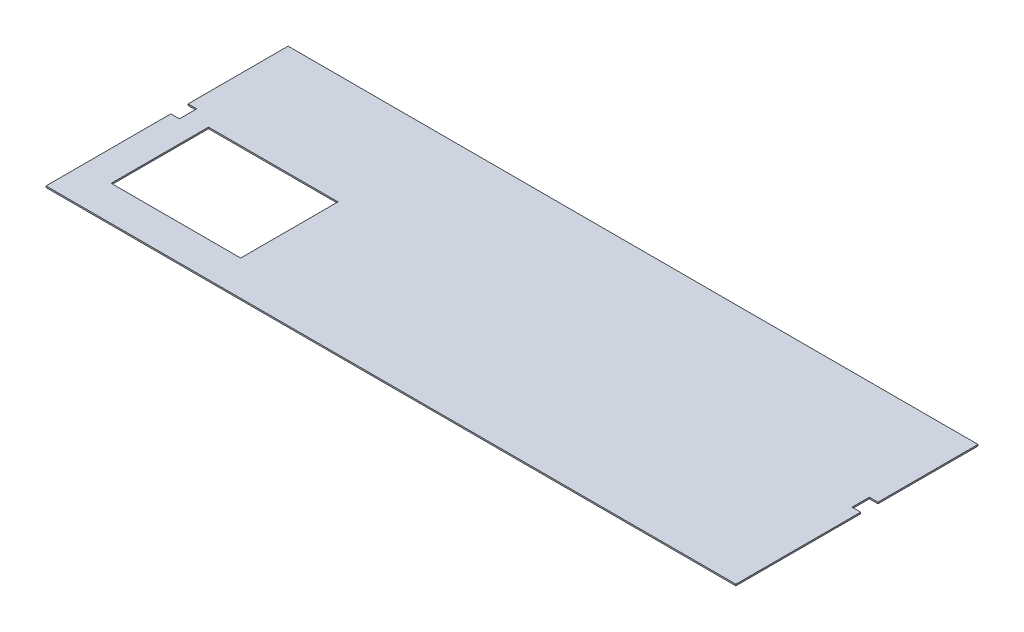
ISO-10303-21;
HEADER;
FILE_DESCRIPTION(('STEP AP214'),'2;1');
FILE_NAME('part.step','',(''),(''),'','','');
FILE_SCHEMA(('AUTOMOTIVE_DESIGN { 1 0 10303 214 1 1 1 1 }'));
ENDSEC;
DATA;
#1=APPLICATION_CONTEXT('core data for automotive mechanical design processes');
#2=APPLICATION_PROTOCOL_DEFINITION('international standard','automotive_design',2000,#1);
#3=PRODUCT_CONTEXT('',#1,'mechanical');
#4=PRODUCT('Part','Part','',(#3));
#5=PRODUCT_RELATED_PRODUCT_CATEGORY('part','',(#4));
#6=PRODUCT_DEFINITION_FORMATION('','',#4);
#7=PRODUCT_DEFINITION_CONTEXT('part definition',#1,'design');
#8=PRODUCT_DEFINITION('design','',#6,#7);
#9=PRODUCT_DEFINITION_SHAPE('','',#8);
#10=(LENGTH_UNIT() NAMED_UNIT(*) SI_UNIT(.MILLI.,.METRE.));
#11=(NAMED_UNIT(*) PLANE_ANGLE_UNIT() SI_UNIT($,.RADIAN.));
#12=(NAMED_UNIT(*) SI_UNIT($,.STERADIAN.) SOLID_ANGLE_UNIT());
#13=UNCERTAINTY_MEASURE_WITH_UNIT(LENGTH_MEASURE(1.E-05),#10,'distance_accuracy_value','');
#14=(GEOMETRIC_REPRESENTATION_CONTEXT(3) GLOBAL_UNCERTAINTY_ASSIGNED_CONTEXT((#13)) GLOBAL_UNIT_ASSIGNED_CONTEXT((#10,
#11,#12)) REPRESENTATION_CONTEXT('',''));
#15=CARTESIAN_POINT('',(0.,0.,0.));
#16=DIRECTION('',(0.,0.,1.));
#17=DIRECTION('',(1.,0.,0.));
#18=AXIS2_PLACEMENT_3D('',#15,#16,#17);
#19=CARTESIAN_POINT('',(762.,3.175,-46.42));
#20=DIRECTION('',(-1.,0.,0.));
#21=DIRECTION('',(0.,0.,1.));
#22=AXIS2_PLACEMENT_3D('',#19,#20,#21);
#23=PLANE('',#22);
#24=DIRECTION('',(0.,0.,-1.));
#25=VECTOR('',#24,1.);
#26=CARTESIAN_POINT('',(762.,0.,-46.42));
#27=LINE('',#26,#25);
#28=CARTESIAN_POINT('',(762.,0.,-46.42));
#29=VERTEX_POINT('',#28);
#30=CARTESIAN_POINT('',(762.,0.,-267.42));
#31=VERTEX_POINT('',#30);
#32=EDGE_CURVE('E163',#29,#31,#27,.T.);
#33=ORIENTED_EDGE('',*,*,#32,.T.);
#34=DIRECTION('',(0.,-1.,0.));
#35=VECTOR('',#34,1.);
#36=CARTESIAN_POINT('',(762.,3.175,-267.42));
#37=LINE('',#36,#35);
#38=CARTESIAN_POINT('',(762.,3.175,-267.42));
#39=VERTEX_POINT('',#38);
#40=EDGE_CURVE('E11',#39,#31,#37,.T.);
#41=ORIENTED_EDGE('',*,*,#40,.F.);
#42=DIRECTION('',(0.,0.,-1.));
#43=VECTOR('',#42,1.);
#44=CARTESIAN_POINT('',(762.,3.175,-46.42));
#45=LINE('',#44,#43);
#46=CARTESIAN_POINT('',(762.,3.175,-46.42));
#47=VERTEX_POINT('',#46);
#48=EDGE_CURVE('E192',#47,#39,#45,.T.);
#49=ORIENTED_EDGE('',*,*,#48,.F.);
#50=DIRECTION('',(0.,-1.,0.));
#51=VECTOR('',#50,1.);
#52=CARTESIAN_POINT('',(762.,3.175,-46.42));
#53=LINE('',#52,#51);
#54=EDGE_CURVE('E218',#47,#29,#53,.T.);
#55=ORIENTED_EDGE('',*,*,#54,.T.);
#56=EDGE_LOOP('',(#33,#41,#49,#55));
#57=FACE_BOUND('',#56,.T.);
#58=ADVANCED_FACE('F45',(#57),#23,.F.);
#59=CARTESIAN_POINT('',(-762.,3.175,-267.42));
#60=DIRECTION('',(0.,0.,1.));
#61=DIRECTION('',(1.,0.,0.));
#62=AXIS2_PLACEMENT_3D('',#59,#60,#61);
#63=PLANE('',#62);
#64=DIRECTION('',(-1.,0.,0.));
#65=VECTOR('',#64,1.);
#66=CARTESIAN_POINT('',(-762.,0.,-267.42));
#67=LINE('',#66,#65);
#68=CARTESIAN_POINT('',(-762.,0.,-267.42));
#69=VERTEX_POINT('',#68);
#70=EDGE_CURVE('E221',#31,#69,#67,.T.);
#71=ORIENTED_EDGE('',*,*,#70,.T.);
#72=DIRECTION('',(0.,-1.,0.));
#73=VECTOR('',#72,1.);
#74=CARTESIAN_POINT('',(-762.,3.175,-267.42));
#75=LINE('',#74,#73);
#76=CARTESIAN_POINT('',(-762.,3.175,-267.42));
#77=VERTEX_POINT('',#76);
#78=EDGE_CURVE('E52',#77,#69,#75,.T.);
#79=ORIENTED_EDGE('',*,*,#78,.F.);
#80=DIRECTION('',(-1.,0.,0.));
#81=VECTOR('',#80,1.);
#82=CARTESIAN_POINT('',(-762.,3.175,-267.42));
#83=LINE('',#82,#81);
#84=EDGE_CURVE('E195',#39,#77,#83,.T.);
#85=ORIENTED_EDGE('',*,*,#84,.F.);
#86=ORIENTED_EDGE('',*,*,#40,.T.);
#87=EDGE_LOOP('',(#71,#79,#85,#86));
#88=FACE_BOUND('',#87,.T.);
#89=ADVANCED_FACE('F296',(#88),#63,.F.);
#90=CARTESIAN_POINT('',(-762.,3.175,-46.42));
#91=DIRECTION('',(1.,0.,0.));
#92=DIRECTION('',(0.,0.,-1.));
#93=AXIS2_PLACEMENT_3D('',#90,#91,#92);
#94=PLANE('',#93);
#95=DIRECTION('',(0.,0.,1.));
#96=VECTOR('',#95,1.);
#97=CARTESIAN_POINT('',(-762.,0.,-46.42));
#98=LINE('',#97,#96);
#99=CARTESIAN_POINT('',(-762.,0.,-46.42));
#100=VERTEX_POINT('',#99);
#101=EDGE_CURVE('E223',#69,#100,#98,.T.);
#102=ORIENTED_EDGE('',*,*,#101,.T.);
#103=DIRECTION('',(0.,-1.,0.));
#104=VECTOR('',#103,1.);
#105=CARTESIAN_POINT('',(-762.,3.175,-46.42));
#106=LINE('',#105,#104);
#107=CARTESIAN_POINT('',(-762.,3.175,-46.42));
#108=VERTEX_POINT('',#107);
#109=EDGE_CURVE('E268',#108,#100,#106,.T.);
#110=ORIENTED_EDGE('',*,*,#109,.F.);
#111=DIRECTION('',(0.,0.,1.));
#112=VECTOR('',#111,1.);
#113=CARTESIAN_POINT('',(-762.,3.175,-46.42));
#114=LINE('',#113,#112);
#115=EDGE_CURVE('E198',#77,#108,#114,.T.);
#116=ORIENTED_EDGE('',*,*,#115,.F.);
#117=ORIENTED_EDGE('',*,*,#78,.T.);
#118=EDGE_LOOP('',(#102,#110,#116,#117));
#119=FACE_BOUND('',#118,.T.);
#120=ADVANCED_FACE('F275',(#119),#94,.F.);
#121=CARTESIAN_POINT('',(-762.,3.175,-46.42));
#122=DIRECTION('',(0.,0.,-1.));
#123=DIRECTION('',(-1.,0.,0.));
#124=AXIS2_PLACEMENT_3D('',#121,#122,#123);
#125=PLANE('',#124);
#126=DIRECTION('',(1.,0.,0.));
#127=VECTOR('',#126,1.);
#128=CARTESIAN_POINT('',(-762.,0.,-46.42));
#129=LINE('',#128,#127);
#130=CARTESIAN_POINT('',(-742.95,0.,-46.42));
#131=VERTEX_POINT('',#130);
#132=EDGE_CURVE('E225',#100,#131,#129,.T.);
#133=ORIENTED_EDGE('',*,*,#132,.T.);
#134=DIRECTION('',(0.,-1.,0.));
#135=VECTOR('',#134,1.);
#136=CARTESIAN_POINT('',(-742.95,3.175,-46.42));
#137=LINE('',#136,#135);
#138=CARTESIAN_POINT('',(-742.95,3.175,-46.42));
#139=VERTEX_POINT('',#138);
#140=EDGE_CURVE('E265',#139,#131,#137,.T.);
#141=ORIENTED_EDGE('',*,*,#140,.F.);
#142=DIRECTION('',(1.,0.,0.));
#143=VECTOR('',#142,1.);
#144=CARTESIAN_POINT('',(-762.,3.175,-46.42));
#145=LINE('',#144,#143);
#146=EDGE_CURVE('E200',#108,#139,#145,.T.);
#147=ORIENTED_EDGE('',*,*,#146,.F.);
#148=ORIENTED_EDGE('',*,*,#109,.T.);
#149=EDGE_LOOP('',(#133,#141,#147,#148));
#150=FACE_BOUND('',#149,.T.);
#151=ADVANCED_FACE('F284',(#150),#125,.F.);
#152=CARTESIAN_POINT('',(-742.95,3.175,-46.42));
#153=DIRECTION('',(1.,0.,0.));
#154=DIRECTION('',(0.,0.,-1.));
#155=AXIS2_PLACEMENT_3D('',#152,#153,#154);
#156=PLANE('',#155);
#157=DIRECTION('',(0.,0.,1.));
#158=VECTOR('',#157,1.);
#159=CARTESIAN_POINT('',(-742.95,0.,-46.42));
#160=LINE('',#159,#158);
#161=CARTESIAN_POINT('',(-742.95,0.,-8.32000000000004));
#162=VERTEX_POINT('',#161);
#163=EDGE_CURVE('E227',#131,#162,#160,.T.);
#164=ORIENTED_EDGE('',*,*,#163,.T.);
#165=DIRECTION('',(0.,-1.,0.));
#166=VECTOR('',#165,1.);
#167=CARTESIAN_POINT('',(-742.95,3.175,-8.32000000000004));
#168=LINE('',#167,#166);
#169=CARTESIAN_POINT('',(-742.95,3.175,-8.32000000000004));
#170=VERTEX_POINT('',#169);
#171=EDGE_CURVE('E262',#170,#162,#168,.T.);
#172=ORIENTED_EDGE('',*,*,#171,.F.);
#173=DIRECTION('',(0.,0.,1.));
#174=VECTOR('',#173,1.);
#175=CARTESIAN_POINT('',(-742.95,3.175,-46.42));
#176=LINE('',#175,#174);
#177=EDGE_CURVE('E202',#139,#170,#176,.T.);
#178=ORIENTED_EDGE('',*,*,#177,.F.);
#179=ORIENTED_EDGE('',*,*,#140,.T.);
#180=EDGE_LOOP('',(#164,#172,#178,#179));
#181=FACE_BOUND('',#180,.T.);
#182=ADVANCED_FACE('F288',(#181),#156,.F.);
#183=CARTESIAN_POINT('',(-742.95,3.175,-8.32000000000004));
#184=DIRECTION('',(0.,0.,1.));
#185=DIRECTION('',(1.,0.,0.));
#186=AXIS2_PLACEMENT_3D('',#183,#184,#185);
#187=PLANE('',#186);
#188=DIRECTION('',(-1.,0.,0.));
#189=VECTOR('',#188,1.);
#190=CARTESIAN_POINT('',(-742.95,0.,-8.32000000000004));
#191=LINE('',#190,#189);
#192=CARTESIAN_POINT('',(-762.,0.,-8.32000000000004));
#193=VERTEX_POINT('',#192);
#194=EDGE_CURVE('E229',#162,#193,#191,.T.);
#195=ORIENTED_EDGE('',*,*,#194,.T.);
#196=DIRECTION('',(0.,-1.,0.));
#197=VECTOR('',#196,1.);
#198=CARTESIAN_POINT('',(-762.,3.175,-8.32000000000004));
#199=LINE('',#198,#197);
#200=CARTESIAN_POINT('',(-762.,3.175,-8.32000000000004));
#201=VERTEX_POINT('',#200);
#202=EDGE_CURVE('E259',#201,#193,#199,.T.);
#203=ORIENTED_EDGE('',*,*,#202,.F.);
#204=DIRECTION('',(-1.,0.,0.));
#205=VECTOR('',#204,1.);
#206=CARTESIAN_POINT('',(-742.95,3.175,-8.32000000000004));
#207=LINE('',#206,#205);
#208=EDGE_CURVE('E204',#170,#201,#207,.T.);
#209=ORIENTED_EDGE('',*,*,#208,.F.);
#210=ORIENTED_EDGE('',*,*,#171,.T.);
#211=EDGE_LOOP('',(#195,#203,#209,#210));
#212=FACE_BOUND('',#211,.T.);
#213=ADVANCED_FACE('F329',(#212),#187,.F.);
#214=CARTESIAN_POINT('',(-762.,3.175,267.42));
#215=DIRECTION('',(1.,0.,0.));
#216=DIRECTION('',(0.,0.,-1.));
#217=AXIS2_PLACEMENT_3D('',#214,#215,#216);
#218=PLANE('',#217);
#219=DIRECTION('',(0.,0.,1.));
#220=VECTOR('',#219,1.);
#221=CARTESIAN_POINT('',(-762.,0.,267.42));
#222=LINE('',#221,#220);
#223=CARTESIAN_POINT('',(-762.,0.,267.42));
#224=VERTEX_POINT('',#223);
#225=EDGE_CURVE('E231',#193,#224,#222,.T.);
#226=ORIENTED_EDGE('',*,*,#225,.T.);
#227=DIRECTION('',(0.,-1.,0.));
#228=VECTOR('',#227,1.);
#229=CARTESIAN_POINT('',(-762.,3.175,267.42));
#230=LINE('',#229,#228);
#231=CARTESIAN_POINT('',(-762.,3.175,267.42));
#232=VERTEX_POINT('',#231);
#233=EDGE_CURVE('E256',#232,#224,#230,.T.);
#234=ORIENTED_EDGE('',*,*,#233,.F.);
#235=DIRECTION('',(0.,0.,1.));
#236=VECTOR('',#235,1.);
#237=CARTESIAN_POINT('',(-762.,3.175,267.42));
#238=LINE('',#237,#236);
#239=EDGE_CURVE('E206',#201,#232,#238,.T.);
#240=ORIENTED_EDGE('',*,*,#239,.F.);
#241=ORIENTED_EDGE('',*,*,#202,.T.);
#242=EDGE_LOOP('',(#226,#234,#240,#241));
#243=FACE_BOUND('',#242,.T.);
#244=ADVANCED_FACE('F327',(#243),#218,.F.);
#245=CARTESIAN_POINT('',(-762.,3.175,267.42));
#246=DIRECTION('',(0.,0.,-1.));
#247=DIRECTION('',(-1.,0.,0.));
#248=AXIS2_PLACEMENT_3D('',#245,#246,#247);
#249=PLANE('',#248);
#250=DIRECTION('',(1.,0.,0.));
#251=VECTOR('',#250,1.);
#252=CARTESIAN_POINT('',(-762.,0.,267.42));
#253=LINE('',#252,#251);
#254=CARTESIAN_POINT('',(762.,0.,267.42));
#255=VERTEX_POINT('',#254);
#256=EDGE_CURVE('E233',#224,#255,#253,.T.);
#257=ORIENTED_EDGE('',*,*,#256,.T.);
#258=DIRECTION('',(0.,-1.,0.));
#259=VECTOR('',#258,1.);
#260=CARTESIAN_POINT('',(762.,3.175,267.42));
#261=LINE('',#260,#259);
#262=CARTESIAN_POINT('',(762.,3.175,267.42));
#263=VERTEX_POINT('',#262);
#264=EDGE_CURVE('E253',#263,#255,#261,.T.);
#265=ORIENTED_EDGE('',*,*,#264,.F.);
#266=DIRECTION('',(1.,0.,0.));
#267=VECTOR('',#266,1.);
#268=CARTESIAN_POINT('',(-762.,3.175,267.42));
#269=LINE('',#268,#267);
#270=EDGE_CURVE('E208',#232,#263,#269,.T.);
#271=ORIENTED_EDGE('',*,*,#270,.F.);
#272=ORIENTED_EDGE('',*,*,#233,.T.);
#273=EDGE_LOOP('',(#257,#265,#271,#272));
#274=FACE_BOUND('',#273,.T.);
#275=ADVANCED_FACE('F323',(#274),#249,.F.);
#276=CARTESIAN_POINT('',(762.,3.175,267.42));
#277=DIRECTION('',(-1.,0.,0.));
#278=DIRECTION('',(0.,0.,1.));
#279=AXIS2_PLACEMENT_3D('',#276,#277,#278);
#280=PLANE('',#279);
#281=DIRECTION('',(0.,0.,-1.));
#282=VECTOR('',#281,1.);
#283=CARTESIAN_POINT('',(762.,0.,267.42));
#284=LINE('',#283,#282);
#285=CARTESIAN_POINT('',(762.,0.,-8.32000000000004));
#286=VERTEX_POINT('',#285);
#287=EDGE_CURVE('E235',#255,#286,#284,.T.);
#288=ORIENTED_EDGE('',*,*,#287,.T.);
#289=DIRECTION('',(0.,-1.,0.));
#290=VECTOR('',#289,1.);
#291=CARTESIAN_POINT('',(762.,3.175,-8.32000000000004));
#292=LINE('',#291,#290);
#293=CARTESIAN_POINT('',(762.,3.175,-8.32000000000004));
#294=VERTEX_POINT('',#293);
#295=EDGE_CURVE('E250',#294,#286,#292,.T.);
#296=ORIENTED_EDGE('',*,*,#295,.F.);
#297=DIRECTION('',(0.,0.,-1.));
#298=VECTOR('',#297,1.);
#299=CARTESIAN_POINT('',(762.,3.175,267.42));
#300=LINE('',#299,#298);
#301=EDGE_CURVE('E210',#263,#294,#300,.T.);
#302=ORIENTED_EDGE('',*,*,#301,.F.);
#303=ORIENTED_EDGE('',*,*,#264,.T.);
#304=EDGE_LOOP('',(#288,#296,#302,#303));
#305=FACE_BOUND('',#304,.T.);
#306=ADVANCED_FACE('F318',(#305),#280,.F.);
#307=CARTESIAN_POINT('',(742.95,3.175,-8.32000000000004));
#308=DIRECTION('',(0.,0.,1.));
#309=DIRECTION('',(1.,0.,0.));
#310=AXIS2_PLACEMENT_3D('',#307,#308,#309);
#311=PLANE('',#310);
#312=DIRECTION('',(-1.,0.,0.));
#313=VECTOR('',#312,1.);
#314=CARTESIAN_POINT('',(742.95,0.,-8.32000000000004));
#315=LINE('',#314,#313);
#316=CARTESIAN_POINT('',(742.95,0.,-8.32000000000004));
#317=VERTEX_POINT('',#316);
#318=EDGE_CURVE('E237',#286,#317,#315,.T.);
#319=ORIENTED_EDGE('',*,*,#318,.T.);
#320=DIRECTION('',(0.,-1.,0.));
#321=VECTOR('',#320,1.);
#322=CARTESIAN_POINT('',(742.95,3.175,-8.32000000000004));
#323=LINE('',#322,#321);
#324=CARTESIAN_POINT('',(742.95,3.175,-8.32000000000004));
#325=VERTEX_POINT('',#324);
#326=EDGE_CURVE('E247',#325,#317,#323,.T.);
#327=ORIENTED_EDGE('',*,*,#326,.F.);
#328=DIRECTION('',(-1.,0.,0.));
#329=VECTOR('',#328,1.);
#330=CARTESIAN_POINT('',(742.95,3.175,-8.32000000000004));
#331=LINE('',#330,#329);
#332=EDGE_CURVE('E212',#294,#325,#331,.T.);
#333=ORIENTED_EDGE('',*,*,#332,.F.);
#334=ORIENTED_EDGE('',*,*,#295,.T.);
#335=EDGE_LOOP('',(#319,#327,#333,#334));
#336=FACE_BOUND('',#335,.T.);
#337=ADVANCED_FACE('F312',(#336),#311,.F.);
#338=CARTESIAN_POINT('',(742.95,3.175,-46.42));
#339=DIRECTION('',(-1.,0.,0.));
#340=DIRECTION('',(0.,0.,1.));
#341=AXIS2_PLACEMENT_3D('',#338,#339,#340);
#342=PLANE('',#341);
#343=DIRECTION('',(0.,0.,-1.));
#344=VECTOR('',#343,1.);
#345=CARTESIAN_POINT('',(742.95,0.,-46.42));
#346=LINE('',#345,#344);
#347=CARTESIAN_POINT('',(742.95,0.,-46.42));
#348=VERTEX_POINT('',#347);
#349=EDGE_CURVE('E239',#317,#348,#346,.T.);
#350=ORIENTED_EDGE('',*,*,#349,.T.);
#351=DIRECTION('',(0.,-1.,0.));
#352=VECTOR('',#351,1.);
#353=CARTESIAN_POINT('',(742.95,3.175,-46.42));
#354=LINE('',#353,#352);
#355=CARTESIAN_POINT('',(742.95,3.175,-46.42));
#356=VERTEX_POINT('',#355);
#357=EDGE_CURVE('E244',#356,#348,#354,.T.);
#358=ORIENTED_EDGE('',*,*,#357,.F.);
#359=DIRECTION('',(0.,0.,-1.));
#360=VECTOR('',#359,1.);
#361=CARTESIAN_POINT('',(742.95,3.175,-46.42));
#362=LINE('',#361,#360);
#363=EDGE_CURVE('E214',#325,#356,#362,.T.);
#364=ORIENTED_EDGE('',*,*,#363,.F.);
#365=ORIENTED_EDGE('',*,*,#326,.T.);
#366=EDGE_LOOP('',(#350,#358,#364,#365));
#367=FACE_BOUND('',#366,.T.);
#368=ADVANCED_FACE('F308',(#367),#342,.F.);
#369=CARTESIAN_POINT('',(762.,3.175,-46.42));
#370=DIRECTION('',(0.,0.,-1.));
#371=DIRECTION('',(-1.,0.,0.));
#372=AXIS2_PLACEMENT_3D('',#369,#370,#371);
#373=PLANE('',#372);
#374=DIRECTION('',(1.,0.,0.));
#375=VECTOR('',#374,1.);
#376=CARTESIAN_POINT('',(762.,0.,-46.42));
#377=LINE('',#376,#375);
#378=EDGE_CURVE('E196',#348,#29,#377,.T.);
#379=ORIENTED_EDGE('',*,*,#378,.T.);
#380=ORIENTED_EDGE('',*,*,#54,.F.);
#381=DIRECTION('',(1.,0.,0.));
#382=VECTOR('',#381,1.);
#383=CARTESIAN_POINT('',(762.,3.175,-46.42));
#384=LINE('',#383,#382);
#385=EDGE_CURVE('E216',#356,#47,#384,.T.);
#386=ORIENTED_EDGE('',*,*,#385,.F.);
#387=ORIENTED_EDGE('',*,*,#357,.T.);
#388=EDGE_LOOP('',(#379,#380,#386,#387));
#389=FACE_BOUND('',#388,.T.);
#390=ADVANCED_FACE('F303',(#389),#373,.F.);
#391=CARTESIAN_POINT('',(0.,3.175,0.));
#392=DIRECTION('',(0.,-1.,0.));
#393=DIRECTION('',(0.,0.,-1.));
#394=AXIS2_PLACEMENT_3D('',#391,#392,#393);
#395=PLANE('',#394);
#396=DIRECTION('',(1.,0.,0.));
#397=VECTOR('',#396,1.);
#398=CARTESIAN_POINT('',(-695.,3.175,190.42));
#399=LINE('',#398,#397);
#400=CARTESIAN_POINT('',(-695.,3.175,190.42));
#401=VERTEX_POINT('',#400);
#402=CARTESIAN_POINT('',(-409.,3.175,190.42));
#403=VERTEX_POINT('',#402);
#404=EDGE_CURVE('E176',#401,#403,#399,.T.);
#405=ORIENTED_EDGE('',*,*,#404,.F.);
#406=DIRECTION('',(0.,0.,1.));
#407=VECTOR('',#406,1.);
#408=CARTESIAN_POINT('',(-695.,3.175,190.42));
#409=LINE('',#408,#407);
#410=CARTESIAN_POINT('',(-695.,3.175,-24.58));
#411=VERTEX_POINT('',#410);
#412=EDGE_CURVE('E59',#411,#401,#409,.T.);
#413=ORIENTED_EDGE('',*,*,#412,.F.);
#414=DIRECTION('',(-1.,0.,0.));
#415=VECTOR('',#414,1.);
#416=CARTESIAN_POINT('',(-695.,3.175,-24.58));
#417=LINE('',#416,#415);
#418=CARTESIAN_POINT('',(-409.,3.175,-24.58));
#419=VERTEX_POINT('',#418);
#420=EDGE_CURVE('E169',#419,#411,#417,.T.);
#421=ORIENTED_EDGE('',*,*,#420,.F.);
#422=DIRECTION('',(0.,0.,-1.));
#423=VECTOR('',#422,1.);
#424=CARTESIAN_POINT('',(-409.,3.175,190.42));
#425=LINE('',#424,#423);
#426=EDGE_CURVE('E183',#403,#419,#425,.T.);
#427=ORIENTED_EDGE('',*,*,#426,.F.);
#428=EDGE_LOOP('',(#405,#413,#421,#427));
#429=FACE_BOUND('',#428,.T.);
#430=ORIENTED_EDGE('',*,*,#48,.T.);
#431=ORIENTED_EDGE('',*,*,#84,.T.);
#432=ORIENTED_EDGE('',*,*,#115,.T.);
#433=ORIENTED_EDGE('',*,*,#146,.T.);
#434=ORIENTED_EDGE('',*,*,#177,.T.);
#435=ORIENTED_EDGE('',*,*,#208,.T.);
#436=ORIENTED_EDGE('',*,*,#239,.T.);
#437=ORIENTED_EDGE('',*,*,#270,.T.);
#438=ORIENTED_EDGE('',*,*,#301,.T.);
#439=ORIENTED_EDGE('',*,*,#332,.T.);
#440=ORIENTED_EDGE('',*,*,#363,.T.);
#441=ORIENTED_EDGE('',*,*,#385,.T.);
#442=EDGE_LOOP('',(#430,#431,#432,#433,#434,#435,#436,#437,#438,#439,#440,#441));
#443=FACE_BOUND('',#442,.T.);
#444=ADVANCED_FACE('F292',(#429,#443),#395,.F.);
#445=CARTESIAN_POINT('',(0.,0.,0.));
#446=DIRECTION('',(0.,-1.,0.));
#447=DIRECTION('',(0.,0.,-1.));
#448=AXIS2_PLACEMENT_3D('',#445,#446,#447);
#449=PLANE('',#448);
#450=DIRECTION('',(0.,0.,1.));
#451=VECTOR('',#450,1.);
#452=CARTESIAN_POINT('',(-695.,0.,190.42));
#453=LINE('',#452,#451);
#454=CARTESIAN_POINT('',(-695.,0.,-24.58));
#455=VERTEX_POINT('',#454);
#456=CARTESIAN_POINT('',(-695.,0.,190.42));
#457=VERTEX_POINT('',#456);
#458=EDGE_CURVE('E167',#455,#457,#453,.T.);
#459=ORIENTED_EDGE('',*,*,#458,.T.);
#460=DIRECTION('',(1.,0.,0.));
#461=VECTOR('',#460,1.);
#462=CARTESIAN_POINT('',(-695.,0.,190.42));
#463=LINE('',#462,#461);
#464=CARTESIAN_POINT('',(-409.,0.,190.42));
#465=VERTEX_POINT('',#464);
#466=EDGE_CURVE('E156',#457,#465,#463,.T.);
#467=ORIENTED_EDGE('',*,*,#466,.T.);
#468=DIRECTION('',(0.,0.,-1.));
#469=VECTOR('',#468,1.);
#470=CARTESIAN_POINT('',(-409.,0.,190.42));
#471=LINE('',#470,#469);
#472=CARTESIAN_POINT('',(-409.,0.,-24.58));
#473=VERTEX_POINT('',#472);
#474=EDGE_CURVE('E178',#465,#473,#471,.T.);
#475=ORIENTED_EDGE('',*,*,#474,.T.);
#476=DIRECTION('',(-1.,0.,0.));
#477=VECTOR('',#476,1.);
#478=CARTESIAN_POINT('',(-695.,0.,-24.58));
#479=LINE('',#478,#477);
#480=EDGE_CURVE('E174',#473,#455,#479,.T.);
#481=ORIENTED_EDGE('',*,*,#480,.T.);
#482=EDGE_LOOP('',(#459,#467,#475,#481));
#483=FACE_BOUND('',#482,.T.);
#484=ORIENTED_EDGE('',*,*,#32,.F.);
#485=ORIENTED_EDGE('',*,*,#378,.F.);
#486=ORIENTED_EDGE('',*,*,#349,.F.);
#487=ORIENTED_EDGE('',*,*,#318,.F.);
#488=ORIENTED_EDGE('',*,*,#287,.F.);
#489=ORIENTED_EDGE('',*,*,#256,.F.);
#490=ORIENTED_EDGE('',*,*,#225,.F.);
#491=ORIENTED_EDGE('',*,*,#194,.F.);
#492=ORIENTED_EDGE('',*,*,#163,.F.);
#493=ORIENTED_EDGE('',*,*,#132,.F.);
#494=ORIENTED_EDGE('',*,*,#101,.F.);
#495=ORIENTED_EDGE('',*,*,#70,.F.);
#496=EDGE_LOOP('',(#484,#485,#486,#487,#488,#489,#490,#491,#492,#493,#494,#495));
#497=FACE_BOUND('',#496,.T.);
#498=ADVANCED_FACE('F172',(#483,#497),#449,.T.);
#499=CARTESIAN_POINT('',(-695.,-0.00100000000000013,190.42));
#500=DIRECTION('',(-1.,0.,0.));
#501=DIRECTION('',(0.,0.,1.));
#502=AXIS2_PLACEMENT_3D('',#499,#500,#501);
#503=PLANE('',#502);
#504=DIRECTION('',(0.,1.,0.));
#505=VECTOR('',#504,1.);
#506=CARTESIAN_POINT('',(-695.,-0.00100000000000013,-24.58));
#507=LINE('',#506,#505);
#508=EDGE_CURVE('E164',#455,#411,#507,.T.);
#509=ORIENTED_EDGE('',*,*,#508,.T.);
#510=ORIENTED_EDGE('',*,*,#412,.T.);
#511=DIRECTION('',(0.,1.,0.));
#512=VECTOR('',#511,1.);
#513=CARTESIAN_POINT('',(-695.,-0.00100000000000013,190.42));
#514=LINE('',#513,#512);
#515=EDGE_CURVE('E158',#457,#401,#514,.T.);
#516=ORIENTED_EDGE('',*,*,#515,.F.);
#517=ORIENTED_EDGE('',*,*,#458,.F.);
#518=EDGE_LOOP('',(#509,#510,#516,#517));
#519=FACE_BOUND('',#518,.T.);
#520=ADVANCED_FACE('F166',(#519),#503,.F.);
#521=CARTESIAN_POINT('',(-695.,-0.00100000000000013,-24.58));
#522=DIRECTION('',(0.,0.,-1.));
#523=DIRECTION('',(-1.,0.,0.));
#524=AXIS2_PLACEMENT_3D('',#521,#522,#523);
#525=PLANE('',#524);
#526=DIRECTION('',(0.,1.,0.));
#527=VECTOR('',#526,1.);
#528=CARTESIAN_POINT('',(-409.,-0.00100000000000013,-24.58));
#529=LINE('',#528,#527);
#530=EDGE_CURVE('E189',#473,#419,#529,.T.);
#531=ORIENTED_EDGE('',*,*,#530,.T.);
#532=ORIENTED_EDGE('',*,*,#420,.T.);
#533=ORIENTED_EDGE('',*,*,#508,.F.);
#534=ORIENTED_EDGE('',*,*,#480,.F.);
#535=EDGE_LOOP('',(#531,#532,#533,#534));
#536=FACE_BOUND('',#535,.T.);
#537=ADVANCED_FACE('F434',(#536),#525,.F.);
#538=CARTESIAN_POINT('',(-409.,-0.00100000000000013,190.42));
#539=DIRECTION('',(1.,0.,0.));
#540=DIRECTION('',(0.,0.,-1.));
#541=AXIS2_PLACEMENT_3D('',#538,#539,#540);
#542=PLANE('',#541);
#543=DIRECTION('',(0.,1.,0.));
#544=VECTOR('',#543,1.);
#545=CARTESIAN_POINT('',(-409.,-0.00100000000000013,190.42));
#546=LINE('',#545,#544);
#547=EDGE_CURVE('E67',#465,#403,#546,.T.);
#548=ORIENTED_EDGE('',*,*,#547,.T.);
#549=ORIENTED_EDGE('',*,*,#426,.T.);
#550=ORIENTED_EDGE('',*,*,#530,.F.);
#551=ORIENTED_EDGE('',*,*,#474,.F.);
#552=EDGE_LOOP('',(#548,#549,#550,#551));
#553=FACE_BOUND('',#552,.T.);
#554=ADVANCED_FACE('F443',(#553),#542,.F.);
#555=CARTESIAN_POINT('',(-695.,-0.00100000000000013,190.42));
#556=DIRECTION('',(0.,0.,1.));
#557=DIRECTION('',(1.,0.,0.));
#558=AXIS2_PLACEMENT_3D('',#555,#556,#557);
#559=PLANE('',#558);
#560=ORIENTED_EDGE('',*,*,#515,.T.);
#561=ORIENTED_EDGE('',*,*,#404,.T.);
#562=ORIENTED_EDGE('',*,*,#547,.F.);
#563=ORIENTED_EDGE('',*,*,#466,.F.);
#564=EDGE_LOOP('',(#560,#561,#562,#563));
#565=FACE_BOUND('',#564,.T.);
#566=ADVANCED_FACE('F157',(#565),#559,.F.);
#567=CLOSED_SHELL('',(#58,#89,#120,#151,#182,#213,#244,#275,#306,#337,#368,#390,#444,#498,#520,
#537,#554,#566));
#568=MANIFOLD_SOLID_BREP('B2',#567);
#569=ADVANCED_BREP_SHAPE_REPRESENTATION('',(#18,#568),#14);
#570=SHAPE_DEFINITION_REPRESENTATION(#9,#569);
ENDSEC;
END-ISO-10303-21;
